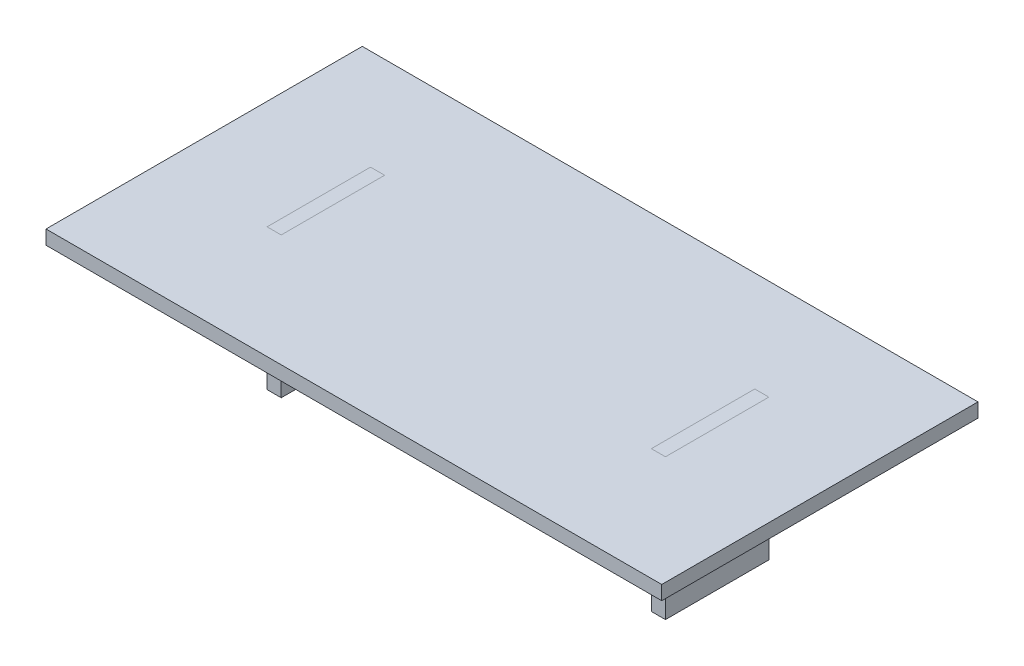
ISO-10303-21;
HEADER;
FILE_DESCRIPTION(('STEP AP214'),'2;1');
FILE_NAME('part.step','',(''),(''),'','','');
FILE_SCHEMA(('AUTOMOTIVE_DESIGN { 1 0 10303 214 1 1 1 1 }'));
ENDSEC;
DATA;
#1=APPLICATION_CONTEXT('core data for automotive mechanical design processes');
#2=APPLICATION_PROTOCOL_DEFINITION('international standard','automotive_design',2000,#1);
#3=PRODUCT_CONTEXT('',#1,'mechanical');
#4=PRODUCT('Part','Part','',(#3));
#5=PRODUCT_RELATED_PRODUCT_CATEGORY('part','',(#4));
#6=PRODUCT_DEFINITION_FORMATION('','',#4);
#7=PRODUCT_DEFINITION_CONTEXT('part definition',#1,'design');
#8=PRODUCT_DEFINITION('design','',#6,#7);
#9=PRODUCT_DEFINITION_SHAPE('','',#8);
#10=(LENGTH_UNIT() NAMED_UNIT(*) SI_UNIT(.MILLI.,.METRE.));
#11=(NAMED_UNIT(*) PLANE_ANGLE_UNIT() SI_UNIT($,.RADIAN.));
#12=(NAMED_UNIT(*) SI_UNIT($,.STERADIAN.) SOLID_ANGLE_UNIT());
#13=UNCERTAINTY_MEASURE_WITH_UNIT(LENGTH_MEASURE(1.E-05),#10,'distance_accuracy_value','');
#14=(GEOMETRIC_REPRESENTATION_CONTEXT(3) GLOBAL_UNCERTAINTY_ASSIGNED_CONTEXT((#13)) GLOBAL_UNIT_ASSIGNED_CONTEXT((#10,
#11,#12)) REPRESENTATION_CONTEXT('',''));
#15=CARTESIAN_POINT('',(0.,0.,0.));
#16=DIRECTION('',(0.,0.,1.));
#17=DIRECTION('',(1.,0.,0.));
#18=AXIS2_PLACEMENT_3D('',#15,#16,#17);
#19=CARTESIAN_POINT('',(0.,-30.,-11.));
#20=DIRECTION('',(0.,0.,-1.));
#21=DIRECTION('',(-1.,0.,0.));
#22=AXIS2_PLACEMENT_3D('',#19,#20,#21);
#23=PLANE('',#22);
#24=DIRECTION('',(-1.,0.,0.));
#25=VECTOR('',#24,1.);
#26=CARTESIAN_POINT('',(0.,0.,-11.));
#27=LINE('',#26,#25);
#28=CARTESIAN_POINT('',(42.1266181229774,0.,-11.));
#29=VERTEX_POINT('',#28);
#30=CARTESIAN_POINT('',(39.1266181229774,0.,-11.));
#31=VERTEX_POINT('',#30);
#32=EDGE_CURVE('E118',#29,#31,#27,.T.);
#33=ORIENTED_EDGE('',*,*,#32,.F.);
#34=DIRECTION('',(0.,1.,0.));
#35=VECTOR('',#34,1.);
#36=CARTESIAN_POINT('',(42.1266181229774,-30.,-11.));
#37=LINE('',#36,#35);
#38=CARTESIAN_POINT('',(42.1266181229774,-30.,-11.));
#39=VERTEX_POINT('',#38);
#40=EDGE_CURVE('E12',#39,#29,#37,.T.);
#41=ORIENTED_EDGE('',*,*,#40,.F.);
#42=DIRECTION('',(-1.,0.,0.));
#43=VECTOR('',#42,1.);
#44=CARTESIAN_POINT('',(0.,-30.,-11.));
#45=LINE('',#44,#43);
#46=CARTESIAN_POINT('',(39.1266181229774,-30.,-11.));
#47=VERTEX_POINT('',#46);
#48=EDGE_CURVE('E112',#39,#47,#45,.T.);
#49=ORIENTED_EDGE('',*,*,#48,.T.);
#50=DIRECTION('',(0.,1.,0.));
#51=VECTOR('',#50,1.);
#52=CARTESIAN_POINT('',(39.1266181229774,-30.,-11.));
#53=LINE('',#52,#51);
#54=EDGE_CURVE('E55',#47,#31,#53,.T.);
#55=ORIENTED_EDGE('',*,*,#54,.T.);
#56=EDGE_LOOP('',(#33,#41,#49,#55));
#57=FACE_BOUND('',#56,.T.);
#58=ADVANCED_FACE('F52',(#57),#23,.T.);
#59=CARTESIAN_POINT('',(42.1266181229774,-30.,0.));
#60=DIRECTION('',(-1.,0.,0.));
#61=DIRECTION('',(0.,0.,1.));
#62=AXIS2_PLACEMENT_3D('',#59,#60,#61);
#63=PLANE('',#62);
#64=CARTESIAN_POINT('',(42.1266181229774,-19.,0.));
#65=DIRECTION('',(1.,0.,0.));
#66=DIRECTION('',(0.,0.,-1.));
#67=AXIS2_PLACEMENT_3D('',#64,#65,#66);
#68=CIRCLE('',#67,1.5);
#69=CARTESIAN_POINT('',(42.1266181229774,-19.,-1.49999999999998));
#70=VERTEX_POINT('',#69);
#71=EDGE_CURVE('E150',#70,#70,#68,.T.);
#72=ORIENTED_EDGE('',*,*,#71,.F.);
#73=EDGE_LOOP('',(#72));
#74=FACE_BOUND('',#73,.T.);
#75=DIRECTION('',(0.,0.,1.));
#76=VECTOR('',#75,1.);
#77=CARTESIAN_POINT('',(42.1266181229774,0.,0.));
#78=LINE('',#77,#76);
#79=CARTESIAN_POINT('',(42.1266181229774,0.,11.));
#80=VERTEX_POINT('',#79);
#81=EDGE_CURVE('E85',#29,#80,#78,.T.);
#82=ORIENTED_EDGE('',*,*,#81,.T.);
#83=DIRECTION('',(0.,1.,0.));
#84=VECTOR('',#83,1.);
#85=CARTESIAN_POINT('',(42.1266181229774,-30.,11.));
#86=LINE('',#85,#84);
#87=CARTESIAN_POINT('',(42.1266181229774,-30.,11.));
#88=VERTEX_POINT('',#87);
#89=EDGE_CURVE('E61',#88,#80,#86,.T.);
#90=ORIENTED_EDGE('',*,*,#89,.F.);
#91=DIRECTION('',(0.,0.,1.));
#92=VECTOR('',#91,1.);
#93=CARTESIAN_POINT('',(42.1266181229774,-30.,0.));
#94=LINE('',#93,#92);
#95=EDGE_CURVE('E102',#39,#88,#94,.T.);
#96=ORIENTED_EDGE('',*,*,#95,.F.);
#97=ORIENTED_EDGE('',*,*,#40,.T.);
#98=EDGE_LOOP('',(#82,#90,#96,#97));
#99=FACE_BOUND('',#98,.T.);
#100=ADVANCED_FACE('F129',(#74,#99),#63,.F.);
#101=CARTESIAN_POINT('',(0.,-30.,11.));
#102=DIRECTION('',(0.,0.,-1.));
#103=DIRECTION('',(-1.,0.,0.));
#104=AXIS2_PLACEMENT_3D('',#101,#102,#103);
#105=PLANE('',#104);
#106=DIRECTION('',(-1.,0.,0.));
#107=VECTOR('',#106,1.);
#108=CARTESIAN_POINT('',(0.,0.,11.));
#109=LINE('',#108,#107);
#110=CARTESIAN_POINT('',(39.1266181229774,0.,11.));
#111=VERTEX_POINT('',#110);
#112=EDGE_CURVE('E109',#80,#111,#109,.T.);
#113=ORIENTED_EDGE('',*,*,#112,.T.);
#114=DIRECTION('',(0.,1.,0.));
#115=VECTOR('',#114,1.);
#116=CARTESIAN_POINT('',(39.1266181229774,-30.,11.));
#117=LINE('',#116,#115);
#118=CARTESIAN_POINT('',(39.1266181229774,-30.,11.));
#119=VERTEX_POINT('',#118);
#120=EDGE_CURVE('E106',#119,#111,#117,.T.);
#121=ORIENTED_EDGE('',*,*,#120,.F.);
#122=DIRECTION('',(-1.,0.,0.));
#123=VECTOR('',#122,1.);
#124=CARTESIAN_POINT('',(0.,-30.,11.));
#125=LINE('',#124,#123);
#126=EDGE_CURVE('E97',#88,#119,#125,.T.);
#127=ORIENTED_EDGE('',*,*,#126,.F.);
#128=ORIENTED_EDGE('',*,*,#89,.T.);
#129=EDGE_LOOP('',(#113,#121,#127,#128));
#130=FACE_BOUND('',#129,.T.);
#131=ADVANCED_FACE('F107',(#130),#105,.F.);
#132=CARTESIAN_POINT('',(39.1266181229774,-30.,0.));
#133=DIRECTION('',(-1.,0.,0.));
#134=DIRECTION('',(0.,0.,1.));
#135=AXIS2_PLACEMENT_3D('',#132,#133,#134);
#136=PLANE('',#135);
#137=CARTESIAN_POINT('',(39.1266181229774,-19.,0.));
#138=DIRECTION('',(-1.,0.,0.));
#139=DIRECTION('',(0.,0.,1.));
#140=AXIS2_PLACEMENT_3D('',#137,#138,#139);
#141=CIRCLE('',#140,1.5);
#142=CARTESIAN_POINT('',(39.1266181229774,-19.,-1.49999999999998));
#143=VERTEX_POINT('',#142);
#144=EDGE_CURVE('E122',#143,#143,#141,.F.);
#145=ORIENTED_EDGE('',*,*,#144,.T.);
#146=EDGE_LOOP('',(#145));
#147=FACE_BOUND('',#146,.T.);
#148=DIRECTION('',(0.,0.,1.));
#149=VECTOR('',#148,1.);
#150=CARTESIAN_POINT('',(39.1266181229774,0.,0.));
#151=LINE('',#150,#149);
#152=EDGE_CURVE('E121',#31,#111,#151,.T.);
#153=ORIENTED_EDGE('',*,*,#152,.F.);
#154=ORIENTED_EDGE('',*,*,#54,.F.);
#155=DIRECTION('',(0.,0.,1.));
#156=VECTOR('',#155,1.);
#157=CARTESIAN_POINT('',(39.1266181229774,-30.,0.));
#158=LINE('',#157,#156);
#159=EDGE_CURVE('E101',#47,#119,#158,.T.);
#160=ORIENTED_EDGE('',*,*,#159,.T.);
#161=ORIENTED_EDGE('',*,*,#120,.T.);
#162=EDGE_LOOP('',(#153,#154,#160,#161));
#163=FACE_BOUND('',#162,.T.);
#164=ADVANCED_FACE('F111',(#147,#163),#136,.T.);
#165=CARTESIAN_POINT('',(0.,-30.,0.));
#166=DIRECTION('',(0.,1.,0.));
#167=DIRECTION('',(0.,0.,1.));
#168=AXIS2_PLACEMENT_3D('',#165,#166,#167);
#169=PLANE('',#168);
#170=ORIENTED_EDGE('',*,*,#48,.F.);
#171=ORIENTED_EDGE('',*,*,#95,.T.);
#172=ORIENTED_EDGE('',*,*,#126,.T.);
#173=ORIENTED_EDGE('',*,*,#159,.F.);
#174=EDGE_LOOP('',(#170,#171,#172,#173));
#175=FACE_BOUND('',#174,.T.);
#176=ADVANCED_FACE('F100',(#175),#169,.F.);
#177=CARTESIAN_POINT('',(0.,0.,0.));
#178=DIRECTION('',(0.,1.,0.));
#179=DIRECTION('',(0.,0.,1.));
#180=AXIS2_PLACEMENT_3D('',#177,#178,#179);
#181=PLANE('',#180);
#182=ORIENTED_EDGE('',*,*,#32,.T.);
#183=ORIENTED_EDGE('',*,*,#152,.T.);
#184=ORIENTED_EDGE('',*,*,#112,.F.);
#185=ORIENTED_EDGE('',*,*,#81,.F.);
#186=EDGE_LOOP('',(#182,#183,#184,#185));
#187=FACE_BOUND('',#186,.T.);
#188=ADVANCED_FACE('F127',(#187),#181,.T.);
#189=CARTESIAN_POINT('',(34.8839774358581,-19.,0.));
#190=DIRECTION('',(1.,0.,0.));
#191=DIRECTION('',(0.,0.,-1.));
#192=AXIS2_PLACEMENT_3D('',#189,#190,#191);
#193=CYLINDRICAL_SURFACE('',#192,1.5);
#194=CARTESIAN_POINT('',(42.1266181229774,-19.,-1.49999999999998));
#195=CARTESIAN_POINT('',(42.0953681229774,-19.,-1.49999999999998));
#196=CARTESIAN_POINT('',(42.0641181229774,-19.,-1.49999999999998));
#197=CARTESIAN_POINT('',(42.0016181229774,-19.,-1.49999999999998));
#198=CARTESIAN_POINT('',(41.9703681229774,-19.,-1.49999999999998));
#199=CARTESIAN_POINT('',(41.9078681229774,-19.,-1.49999999999998));
#200=CARTESIAN_POINT('',(41.8766181229774,-19.,-1.49999999999998));
#201=CARTESIAN_POINT('',(41.8141181229774,-19.,-1.49999999999998));
#202=CARTESIAN_POINT('',(41.7828681229774,-19.,-1.49999999999998));
#203=CARTESIAN_POINT('',(41.7203681229774,-19.,-1.49999999999998));
#204=CARTESIAN_POINT('',(41.6891181229774,-19.,-1.49999999999998));
#205=CARTESIAN_POINT('',(41.6266181229774,-19.,-1.49999999999998));
#206=CARTESIAN_POINT('',(41.5953681229774,-19.,-1.49999999999998));
#207=CARTESIAN_POINT('',(41.5328681229774,-19.,-1.49999999999998));
#208=CARTESIAN_POINT('',(41.5016181229774,-19.,-1.49999999999998));
#209=CARTESIAN_POINT('',(41.4391181229774,-19.,-1.49999999999998));
#210=CARTESIAN_POINT('',(41.4078681229774,-19.,-1.49999999999998));
#211=CARTESIAN_POINT('',(41.3453681229774,-19.,-1.49999999999998));
#212=CARTESIAN_POINT('',(41.3141181229774,-19.,-1.49999999999998));
#213=CARTESIAN_POINT('',(41.2516181229774,-19.,-1.49999999999998));
#214=CARTESIAN_POINT('',(41.2203681229774,-19.,-1.49999999999998));
#215=CARTESIAN_POINT('',(41.1578681229774,-19.,-1.49999999999998));
#216=CARTESIAN_POINT('',(41.1266181229774,-19.,-1.49999999999998));
#217=CARTESIAN_POINT('',(41.0641181229774,-19.,-1.49999999999998));
#218=CARTESIAN_POINT('',(41.0328681229774,-19.,-1.49999999999998));
#219=CARTESIAN_POINT('',(40.9703681229774,-19.,-1.49999999999998));
#220=CARTESIAN_POINT('',(40.9391181229774,-19.,-1.49999999999998));
#221=CARTESIAN_POINT('',(40.8766181229774,-19.,-1.49999999999998));
#222=CARTESIAN_POINT('',(40.8453681229774,-19.,-1.49999999999998));
#223=CARTESIAN_POINT('',(40.7828681229774,-19.,-1.49999999999998));
#224=CARTESIAN_POINT('',(40.7516181229774,-19.,-1.49999999999998));
#225=CARTESIAN_POINT('',(40.6891181229774,-19.,-1.49999999999998));
#226=CARTESIAN_POINT('',(40.6578681229774,-19.,-1.49999999999998));
#227=CARTESIAN_POINT('',(40.5953681229774,-19.,-1.49999999999998));
#228=CARTESIAN_POINT('',(40.5641181229774,-19.,-1.49999999999998));
#229=CARTESIAN_POINT('',(40.5016181229774,-19.,-1.49999999999998));
#230=CARTESIAN_POINT('',(40.4703681229774,-19.,-1.49999999999998));
#231=CARTESIAN_POINT('',(40.4078681229774,-19.,-1.49999999999998));
#232=CARTESIAN_POINT('',(40.3766181229774,-19.,-1.49999999999998));
#233=CARTESIAN_POINT('',(40.3141181229774,-19.,-1.49999999999998));
#234=CARTESIAN_POINT('',(40.2828681229774,-19.,-1.49999999999998));
#235=CARTESIAN_POINT('',(40.2203681229774,-19.,-1.49999999999998));
#236=CARTESIAN_POINT('',(40.1891181229774,-19.,-1.49999999999998));
#237=CARTESIAN_POINT('',(40.1266181229774,-19.,-1.49999999999998));
#238=CARTESIAN_POINT('',(40.0953681229774,-19.,-1.49999999999998));
#239=CARTESIAN_POINT('',(40.0328681229774,-19.,-1.49999999999998));
#240=CARTESIAN_POINT('',(40.0016181229774,-19.,-1.49999999999998));
#241=CARTESIAN_POINT('',(39.9391181229774,-19.,-1.49999999999998));
#242=CARTESIAN_POINT('',(39.9078681229774,-19.,-1.49999999999998));
#243=CARTESIAN_POINT('',(39.8453681229774,-19.,-1.49999999999998));
#244=CARTESIAN_POINT('',(39.8141181229774,-19.,-1.49999999999998));
#245=CARTESIAN_POINT('',(39.7516181229774,-19.,-1.49999999999998));
#246=CARTESIAN_POINT('',(39.7203681229774,-19.,-1.49999999999998));
#247=CARTESIAN_POINT('',(39.6578681229774,-19.,-1.49999999999998));
#248=CARTESIAN_POINT('',(39.6266181229774,-19.,-1.49999999999998));
#249=CARTESIAN_POINT('',(39.5641181229774,-19.,-1.49999999999998));
#250=CARTESIAN_POINT('',(39.5328681229774,-19.,-1.49999999999998));
#251=CARTESIAN_POINT('',(39.4703681229774,-19.,-1.49999999999998));
#252=CARTESIAN_POINT('',(39.4391181229774,-19.,-1.49999999999998));
#253=CARTESIAN_POINT('',(39.3766181229774,-19.,-1.49999999999998));
#254=CARTESIAN_POINT('',(39.3453681229774,-19.,-1.49999999999998));
#255=CARTESIAN_POINT('',(39.2828681229774,-19.,-1.49999999999998));
#256=CARTESIAN_POINT('',(39.2516181229774,-19.,-1.49999999999998));
#257=CARTESIAN_POINT('',(39.1891181229774,-19.,-1.49999999999998));
#258=CARTESIAN_POINT('',(39.1578681229774,-19.,-1.49999999999998));
#259=CARTESIAN_POINT('',(39.1266181229774,-19.,-1.49999999999998));
#260=B_SPLINE_CURVE_WITH_KNOTS('',3,(#194,#195,#196,#197,#198,#199,#200,#201,#202,#203,#204,
#205,#206,#207,#208,#209,#210,#211,#212,#213,#214,#215,#216,#217,#218,#219,#220,#221,#222,#223,
#224,#225,#226,#227,#228,#229,#230,#231,#232,#233,#234,#235,#236,#237,#238,#239,#240,#241,#242,
#243,#244,#245,#246,#247,#248,#249,#250,#251,#252,#253,#254,#255,#256,#257,#258,#259),
.UNSPECIFIED.,.F.,.F.,(4,2,2,2,2,2,2,2,2,2,2,2,2,2,2,2,2,2,2,2,2,2,2,2,2,2,2,2,2,2,2,2,4),(0.,
0.0937499999999966,0.1875,0.281249999999997,0.374999999999993,0.468749999999997,
0.562499999999994,0.656249999999997,0.749999999999994,0.843749999999997,0.937499999999994,
1.03125,1.12499999999999,1.21875,1.31249999999999,1.40624999999999,1.49999999999999,1.59375,
1.68749999999999,1.78124999999999,1.87499999999999,1.96874999999999,2.06249999999999,
2.15624999999999,2.25,2.34374999999999,2.4375,2.53124999999999,2.625,2.71874999999999,
2.81249999999999,2.90624999999999,2.99999999999999),.UNSPECIFIED.);
#261=EDGE_CURVE('BSEAM154',#70,#143,#260,.T.);
#262=ORIENTED_EDGE('',*,*,#71,.T.);
#263=ORIENTED_EDGE('',*,*,#144,.F.);
#264=ORIENTED_EDGE('',*,*,#261,.T.);
#265=ORIENTED_EDGE('',*,*,#261,.F.);
#266=EDGE_LOOP('',(#262,#264,#263,#265));
#267=FACE_BOUND('',#266,.T.);
#268=ADVANCED_FACE('F154',(#267),#193,.F.);
#269=CLOSED_SHELL('',(#58,#100,#131,#164,#176,#188,#268));
#270=MANIFOLD_SOLID_BREP('B2',#269);
#271=CARTESIAN_POINT('',(-39.6233818770227,-30.,0.));
#272=DIRECTION('',(-1.,0.,0.));
#273=DIRECTION('',(0.,0.,1.));
#274=AXIS2_PLACEMENT_3D('',#271,#272,#273);
#275=PLANE('',#274);
#276=CARTESIAN_POINT('',(-39.6233818770227,-13.3431457505077,-5.65685424949241));
#277=DIRECTION('',(-1.,0.,0.));
#278=DIRECTION('',(0.,0.,1.));
#279=AXIS2_PLACEMENT_3D('',#276,#277,#278);
#280=CIRCLE('',#279,1.1);
#281=CARTESIAN_POINT('',(-39.6233818770227,-13.3431457505077,-4.55685424949241));
#282=VERTEX_POINT('',#281);
#283=EDGE_CURVE('E304',#282,#282,#280,.F.);
#284=ORIENTED_EDGE('',*,*,#283,.F.);
#285=EDGE_LOOP('',(#284));
#286=FACE_BOUND('',#285,.T.);
#287=CARTESIAN_POINT('',(-39.6233818770227,-24.6568542494924,5.65685424949237));
#288=DIRECTION('',(-1.,0.,0.));
#289=DIRECTION('',(0.,0.,1.));
#290=AXIS2_PLACEMENT_3D('',#287,#288,#289);
#291=CIRCLE('',#290,1.1);
#292=CARTESIAN_POINT('',(-39.6233818770227,-24.6568542494924,6.75685424949237));
#293=VERTEX_POINT('',#292);
#294=EDGE_CURVE('E299',#293,#293,#291,.F.);
#295=ORIENTED_EDGE('',*,*,#294,.F.);
#296=EDGE_LOOP('',(#295));
#297=FACE_BOUND('',#296,.T.);
#298=CARTESIAN_POINT('',(-39.6233818770227,-13.3431457505077,5.65685424949241));
#299=DIRECTION('',(-1.,0.,0.));
#300=DIRECTION('',(0.,0.,1.));
#301=AXIS2_PLACEMENT_3D('',#298,#299,#300);
#302=CIRCLE('',#301,1.1);
#303=CARTESIAN_POINT('',(-39.6233818770227,-13.3431457505077,6.75685424949241));
#304=VERTEX_POINT('',#303);
#305=EDGE_CURVE('E316',#304,#304,#302,.F.);
#306=ORIENTED_EDGE('',*,*,#305,.F.);
#307=EDGE_LOOP('',(#306));
#308=FACE_BOUND('',#307,.T.);
#309=CARTESIAN_POINT('',(-39.6233818770227,-19.,0.));
#310=DIRECTION('',(-1.,0.,0.));
#311=DIRECTION('',(0.,0.,1.));
#312=AXIS2_PLACEMENT_3D('',#309,#310,#311);
#313=CIRCLE('',#312,3.);
#314=CARTESIAN_POINT('',(-39.6233818770227,-19.,3.));
#315=VERTEX_POINT('',#314);
#316=EDGE_CURVE('E283',#315,#315,#313,.F.);
#317=ORIENTED_EDGE('',*,*,#316,.F.);
#318=EDGE_LOOP('',(#317));
#319=FACE_BOUND('',#318,.T.);
#320=CARTESIAN_POINT('',(-39.6233818770227,-24.6568542494923,-5.65685424949241));
#321=DIRECTION('',(-1.,0.,0.));
#322=DIRECTION('',(0.,0.,1.));
#323=AXIS2_PLACEMENT_3D('',#320,#321,#322);
#324=CIRCLE('',#323,1.1);
#325=CARTESIAN_POINT('',(-39.6233818770227,-24.6568542494923,-4.55685424949241));
#326=VERTEX_POINT('',#325);
#327=EDGE_CURVE('E296',#326,#326,#324,.F.);
#328=ORIENTED_EDGE('',*,*,#327,.F.);
#329=EDGE_LOOP('',(#328));
#330=FACE_BOUND('',#329,.T.);
#331=DIRECTION('',(0.,0.,1.));
#332=VECTOR('',#331,1.);
#333=CARTESIAN_POINT('',(-39.6233818770227,0.,0.));
#334=LINE('',#333,#332);
#335=CARTESIAN_POINT('',(-39.6233818770227,0.,-11.));
#336=VERTEX_POINT('',#335);
#337=CARTESIAN_POINT('',(-39.6233818770227,0.,11.));
#338=VERTEX_POINT('',#337);
#339=EDGE_CURVE('E280',#336,#338,#334,.T.);
#340=ORIENTED_EDGE('',*,*,#339,.T.);
#341=DIRECTION('',(0.,1.,0.));
#342=VECTOR('',#341,1.);
#343=CARTESIAN_POINT('',(-39.6233818770227,-30.,11.));
#344=LINE('',#343,#342);
#345=CARTESIAN_POINT('',(-39.6233818770227,-30.,11.));
#346=VERTEX_POINT('',#345);
#347=EDGE_CURVE('E50',#346,#338,#344,.T.);
#348=ORIENTED_EDGE('',*,*,#347,.F.);
#349=DIRECTION('',(0.,0.,1.));
#350=VECTOR('',#349,1.);
#351=CARTESIAN_POINT('',(-39.6233818770227,-30.,0.));
#352=LINE('',#351,#350);
#353=CARTESIAN_POINT('',(-39.6233818770227,-30.,-11.));
#354=VERTEX_POINT('',#353);
#355=EDGE_CURVE('E236',#354,#346,#352,.T.);
#356=ORIENTED_EDGE('',*,*,#355,.F.);
#357=DIRECTION('',(0.,1.,0.));
#358=VECTOR('',#357,1.);
#359=CARTESIAN_POINT('',(-39.6233818770227,-30.,-11.));
#360=LINE('',#359,#358);
#361=EDGE_CURVE('E221',#354,#336,#360,.T.);
#362=ORIENTED_EDGE('',*,*,#361,.T.);
#363=EDGE_LOOP('',(#340,#348,#356,#362));
#364=FACE_BOUND('',#363,.T.);
#365=ADVANCED_FACE('F218',(#286,#297,#308,#319,#330,#364),#275,.F.);
#366=CARTESIAN_POINT('',(0.,-30.,11.));
#367=DIRECTION('',(0.,0.,1.));
#368=DIRECTION('',(1.,0.,0.));
#369=AXIS2_PLACEMENT_3D('',#366,#367,#368);
#370=PLANE('',#369);
#371=DIRECTION('',(1.,0.,0.));
#372=VECTOR('',#371,1.);
#373=CARTESIAN_POINT('',(0.,0.,11.));
#374=LINE('',#373,#372);
#375=CARTESIAN_POINT('',(-42.6233818770227,0.,11.));
#376=VERTEX_POINT('',#375);
#377=EDGE_CURVE('E286',#376,#338,#374,.T.);
#378=ORIENTED_EDGE('',*,*,#377,.F.);
#379=DIRECTION('',(0.,1.,0.));
#380=VECTOR('',#379,1.);
#381=CARTESIAN_POINT('',(-42.6233818770227,-30.,11.));
#382=LINE('',#381,#380);
#383=CARTESIAN_POINT('',(-42.6233818770227,-30.,11.));
#384=VERTEX_POINT('',#383);
#385=EDGE_CURVE('E227',#384,#376,#382,.T.);
#386=ORIENTED_EDGE('',*,*,#385,.F.);
#387=DIRECTION('',(1.,0.,0.));
#388=VECTOR('',#387,1.);
#389=CARTESIAN_POINT('',(0.,-30.,11.));
#390=LINE('',#389,#388);
#391=EDGE_CURVE('E275',#384,#346,#390,.T.);
#392=ORIENTED_EDGE('',*,*,#391,.T.);
#393=ORIENTED_EDGE('',*,*,#347,.T.);
#394=EDGE_LOOP('',(#378,#386,#392,#393));
#395=FACE_BOUND('',#394,.T.);
#396=ADVANCED_FACE('F326',(#395),#370,.T.);
#397=CARTESIAN_POINT('',(-42.6233818770227,-30.,0.));
#398=DIRECTION('',(-1.,0.,0.));
#399=DIRECTION('',(0.,0.,1.));
#400=AXIS2_PLACEMENT_3D('',#397,#398,#399);
#401=PLANE('',#400);
#402=CARTESIAN_POINT('',(-42.6233818770227,-13.3431457505077,-5.65685424949241));
#403=DIRECTION('',(-1.,0.,0.));
#404=DIRECTION('',(0.,-1.,0.));
#405=AXIS2_PLACEMENT_3D('',#402,#403,#404);
#406=CIRCLE('',#405,1.1);
#407=CARTESIAN_POINT('',(-42.6233818770227,-14.4431457505077,-5.6568542494924));
#408=VERTEX_POINT('',#407);
#409=EDGE_CURVE('E308',#408,#408,#406,.T.);
#410=ORIENTED_EDGE('',*,*,#409,.F.);
#411=EDGE_LOOP('',(#410));
#412=FACE_BOUND('',#411,.T.);
#413=CARTESIAN_POINT('',(-42.6233818770227,-24.6568542494924,5.65685424949237));
#414=DIRECTION('',(-1.,0.,0.));
#415=DIRECTION('',(0.,1.,0.));
#416=AXIS2_PLACEMENT_3D('',#413,#414,#415);
#417=CIRCLE('',#416,1.1);
#418=CARTESIAN_POINT('',(-42.6233818770227,-23.5568542494924,5.65685424949237));
#419=VERTEX_POINT('',#418);
#420=EDGE_CURVE('E313',#419,#419,#417,.T.);
#421=ORIENTED_EDGE('',*,*,#420,.F.);
#422=EDGE_LOOP('',(#421));
#423=FACE_BOUND('',#422,.T.);
#424=CARTESIAN_POINT('',(-42.6233818770227,-13.3431457505077,5.65685424949241));
#425=DIRECTION('',(-1.,0.,0.));
#426=DIRECTION('',(0.,0.,-1.));
#427=AXIS2_PLACEMENT_3D('',#424,#425,#426);
#428=CIRCLE('',#427,1.1);
#429=CARTESIAN_POINT('',(-42.6233818770227,-13.3431457505077,4.55685424949241));
#430=VERTEX_POINT('',#429);
#431=EDGE_CURVE('E307',#430,#430,#428,.T.);
#432=ORIENTED_EDGE('',*,*,#431,.F.);
#433=EDGE_LOOP('',(#432));
#434=FACE_BOUND('',#433,.T.);
#435=CARTESIAN_POINT('',(-42.6233818770227,-19.,0.));
#436=DIRECTION('',(-1.,0.,0.));
#437=DIRECTION('',(0.,0.,1.));
#438=AXIS2_PLACEMENT_3D('',#435,#436,#437);
#439=CIRCLE('',#438,3.);
#440=CARTESIAN_POINT('',(-42.6233818770227,-19.,3.));
#441=VERTEX_POINT('',#440);
#442=EDGE_CURVE('E295',#441,#441,#439,.T.);
#443=ORIENTED_EDGE('',*,*,#442,.F.);
#444=EDGE_LOOP('',(#443));
#445=FACE_BOUND('',#444,.T.);
#446=CARTESIAN_POINT('',(-42.6233818770227,-24.6568542494923,-5.65685424949241));
#447=DIRECTION('',(-1.,0.,0.));
#448=DIRECTION('',(0.,0.,1.));
#449=AXIS2_PLACEMENT_3D('',#446,#447,#448);
#450=CIRCLE('',#449,1.1);
#451=CARTESIAN_POINT('',(-42.6233818770227,-24.6568542494923,-4.55685424949241));
#452=VERTEX_POINT('',#451);
#453=EDGE_CURVE('E292',#452,#452,#450,.T.);
#454=ORIENTED_EDGE('',*,*,#453,.F.);
#455=EDGE_LOOP('',(#454));
#456=FACE_BOUND('',#455,.T.);
#457=DIRECTION('',(0.,0.,1.));
#458=VECTOR('',#457,1.);
#459=CARTESIAN_POINT('',(-42.6233818770227,0.,0.));
#460=LINE('',#459,#458);
#461=CARTESIAN_POINT('',(-42.6233818770227,0.,-11.));
#462=VERTEX_POINT('',#461);
#463=EDGE_CURVE('E268',#462,#376,#460,.T.);
#464=ORIENTED_EDGE('',*,*,#463,.F.);
#465=DIRECTION('',(0.,1.,0.));
#466=VECTOR('',#465,1.);
#467=CARTESIAN_POINT('',(-42.6233818770227,-30.,-11.));
#468=LINE('',#467,#466);
#469=CARTESIAN_POINT('',(-42.6233818770227,-30.,-11.));
#470=VERTEX_POINT('',#469);
#471=EDGE_CURVE('E265',#470,#462,#468,.T.);
#472=ORIENTED_EDGE('',*,*,#471,.F.);
#473=DIRECTION('',(0.,0.,1.));
#474=VECTOR('',#473,1.);
#475=CARTESIAN_POINT('',(-42.6233818770227,-30.,0.));
#476=LINE('',#475,#474);
#477=EDGE_CURVE('E267',#470,#384,#476,.T.);
#478=ORIENTED_EDGE('',*,*,#477,.T.);
#479=ORIENTED_EDGE('',*,*,#385,.T.);
#480=EDGE_LOOP('',(#464,#472,#478,#479));
#481=FACE_BOUND('',#480,.T.);
#482=ADVANCED_FACE('F266',(#412,#423,#434,#445,#456,#481),#401,.T.);
#483=CARTESIAN_POINT('',(0.,-30.,-11.));
#484=DIRECTION('',(0.,0.,1.));
#485=DIRECTION('',(1.,0.,0.));
#486=AXIS2_PLACEMENT_3D('',#483,#484,#485);
#487=PLANE('',#486);
#488=DIRECTION('',(1.,0.,0.));
#489=VECTOR('',#488,1.);
#490=CARTESIAN_POINT('',(0.,0.,-11.));
#491=LINE('',#490,#489);
#492=EDGE_CURVE('E282',#462,#336,#491,.T.);
#493=ORIENTED_EDGE('',*,*,#492,.T.);
#494=ORIENTED_EDGE('',*,*,#361,.F.);
#495=DIRECTION('',(1.,0.,0.));
#496=VECTOR('',#495,1.);
#497=CARTESIAN_POINT('',(0.,-30.,-11.));
#498=LINE('',#497,#496);
#499=EDGE_CURVE('E262',#470,#354,#498,.T.);
#500=ORIENTED_EDGE('',*,*,#499,.F.);
#501=ORIENTED_EDGE('',*,*,#471,.T.);
#502=EDGE_LOOP('',(#493,#494,#500,#501));
#503=FACE_BOUND('',#502,.T.);
#504=ADVANCED_FACE('F271',(#503),#487,.F.);
#505=CARTESIAN_POINT('',(0.,-30.,0.));
#506=DIRECTION('',(0.,1.,0.));
#507=DIRECTION('',(0.,0.,1.));
#508=AXIS2_PLACEMENT_3D('',#505,#506,#507);
#509=PLANE('',#508);
#510=ORIENTED_EDGE('',*,*,#355,.T.);
#511=ORIENTED_EDGE('',*,*,#391,.F.);
#512=ORIENTED_EDGE('',*,*,#477,.F.);
#513=ORIENTED_EDGE('',*,*,#499,.T.);
#514=EDGE_LOOP('',(#510,#511,#512,#513));
#515=FACE_BOUND('',#514,.T.);
#516=ADVANCED_FACE('F274',(#515),#509,.F.);
#517=CARTESIAN_POINT('',(0.,0.,0.));
#518=DIRECTION('',(0.,1.,0.));
#519=DIRECTION('',(0.,0.,1.));
#520=AXIS2_PLACEMENT_3D('',#517,#518,#519);
#521=PLANE('',#520);
#522=ORIENTED_EDGE('',*,*,#339,.F.);
#523=ORIENTED_EDGE('',*,*,#492,.F.);
#524=ORIENTED_EDGE('',*,*,#463,.T.);
#525=ORIENTED_EDGE('',*,*,#377,.T.);
#526=EDGE_LOOP('',(#522,#523,#524,#525));
#527=FACE_BOUND('',#526,.T.);
#528=ADVANCED_FACE('F336',(#527),#521,.T.);
#529=CARTESIAN_POINT('',(-31.1381005027841,-24.6568542494923,-5.65685424949241));
#530=DIRECTION('',(-1.,0.,0.));
#531=DIRECTION('',(0.,0.,1.));
#532=AXIS2_PLACEMENT_3D('',#529,#530,#531);
#533=CYLINDRICAL_SURFACE('',#532,1.1);
#534=ORIENTED_EDGE('',*,*,#327,.T.);
#535=EDGE_LOOP('',(#534));
#536=FACE_BOUND('',#535,.T.);
#537=ORIENTED_EDGE('',*,*,#453,.T.);
#538=EDGE_LOOP('',(#537));
#539=FACE_BOUND('',#538,.T.);
#540=ADVANCED_FACE('F333',(#536,#539),#533,.F.);
#541=CARTESIAN_POINT('',(-31.1381005027841,-19.,0.));
#542=DIRECTION('',(-1.,0.,0.));
#543=DIRECTION('',(0.,0.,1.));
#544=AXIS2_PLACEMENT_3D('',#541,#542,#543);
#545=CYLINDRICAL_SURFACE('',#544,3.);
#546=ORIENTED_EDGE('',*,*,#316,.T.);
#547=EDGE_LOOP('',(#546));
#548=FACE_BOUND('',#547,.T.);
#549=ORIENTED_EDGE('',*,*,#442,.T.);
#550=EDGE_LOOP('',(#549));
#551=FACE_BOUND('',#550,.T.);
#552=ADVANCED_FACE('F335',(#548,#551),#545,.F.);
#553=CARTESIAN_POINT('',(-31.1381005027841,-13.3431457505077,5.65685424949241));
#554=DIRECTION('',(-1.,0.,0.));
#555=DIRECTION('',(0.,0.,1.));
#556=AXIS2_PLACEMENT_3D('',#553,#554,#555);
#557=CYLINDRICAL_SURFACE('',#556,1.1);
#558=ORIENTED_EDGE('',*,*,#305,.T.);
#559=EDGE_LOOP('',(#558));
#560=FACE_BOUND('',#559,.T.);
#561=ORIENTED_EDGE('',*,*,#431,.T.);
#562=EDGE_LOOP('',(#561));
#563=FACE_BOUND('',#562,.T.);
#564=ADVANCED_FACE('F322',(#560,#563),#557,.F.);
#565=CARTESIAN_POINT('',(-31.1381005027841,-24.6568542494924,5.65685424949237));
#566=DIRECTION('',(-1.,0.,0.));
#567=DIRECTION('',(0.,0.,1.));
#568=AXIS2_PLACEMENT_3D('',#565,#566,#567);
#569=CYLINDRICAL_SURFACE('',#568,1.1);
#570=ORIENTED_EDGE('',*,*,#294,.T.);
#571=EDGE_LOOP('',(#570));
#572=FACE_BOUND('',#571,.T.);
#573=ORIENTED_EDGE('',*,*,#420,.T.);
#574=EDGE_LOOP('',(#573));
#575=FACE_BOUND('',#574,.T.);
#576=ADVANCED_FACE('F366',(#572,#575),#569,.F.);
#577=CARTESIAN_POINT('',(-31.1381005027841,-13.3431457505077,-5.65685424949241));
#578=DIRECTION('',(-1.,0.,0.));
#579=DIRECTION('',(0.,0.,1.));
#580=AXIS2_PLACEMENT_3D('',#577,#578,#579);
#581=CYLINDRICAL_SURFACE('',#580,1.1);
#582=ORIENTED_EDGE('',*,*,#283,.T.);
#583=EDGE_LOOP('',(#582));
#584=FACE_BOUND('',#583,.T.);
#585=ORIENTED_EDGE('',*,*,#409,.T.);
#586=EDGE_LOOP('',(#585));
#587=FACE_BOUND('',#586,.T.);
#588=ADVANCED_FACE('F371',(#584,#587),#581,.F.);
#589=CLOSED_SHELL('',(#365,#396,#482,#504,#516,#528,#540,#552,#564,#576,#588));
#590=MANIFOLD_SOLID_BREP('B6',#589);
#591=CARTESIAN_POINT('',(0.,-3.,-11.));
#592=DIRECTION('',(0.,0.,1.));
#593=DIRECTION('',(1.,0.,0.));
#594=AXIS2_PLACEMENT_3D('',#591,#592,#593);
#595=PLANE('',#594);
#596=DIRECTION('',(1.,0.,0.));
#597=VECTOR('',#596,1.);
#598=CARTESIAN_POINT('',(0.,0.,-11.));
#599=LINE('',#598,#597);
#600=CARTESIAN_POINT('',(-42.6233818770227,0.,-11.));
#601=VERTEX_POINT('',#600);
#602=CARTESIAN_POINT('',(-39.6233818770227,0.,-11.));
#603=VERTEX_POINT('',#602);
#604=EDGE_CURVE('E618',#601,#603,#599,.T.);
#605=ORIENTED_EDGE('',*,*,#604,.F.);
#606=DIRECTION('',(0.,1.,0.));
#607=VECTOR('',#606,1.);
#608=CARTESIAN_POINT('',(-42.6233818770227,-3.,-11.));
#609=LINE('',#608,#607);
#610=CARTESIAN_POINT('',(-42.6233818770227,-3.,-11.));
#611=VERTEX_POINT('',#610);
#612=EDGE_CURVE('E216',#611,#601,#609,.T.);
#613=ORIENTED_EDGE('',*,*,#612,.F.);
#614=DIRECTION('',(1.,0.,0.));
#615=VECTOR('',#614,1.);
#616=CARTESIAN_POINT('',(0.,-3.,-11.));
#617=LINE('',#616,#615);
#618=CARTESIAN_POINT('',(-39.6233818770227,-3.,-11.));
#619=VERTEX_POINT('',#618);
#620=EDGE_CURVE('E578',#611,#619,#617,.T.);
#621=ORIENTED_EDGE('',*,*,#620,.T.);
#622=DIRECTION('',(0.,1.,0.));
#623=VECTOR('',#622,1.);
#624=CARTESIAN_POINT('',(-39.6233818770227,-3.,-11.));
#625=LINE('',#624,#623);
#626=EDGE_CURVE('E574',#619,#603,#625,.T.);
#627=ORIENTED_EDGE('',*,*,#626,.T.);
#628=EDGE_LOOP('',(#605,#613,#621,#627));
#629=FACE_BOUND('',#628,.T.);
#630=ADVANCED_FACE('F459',(#629),#595,.T.);
#631=CARTESIAN_POINT('',(-42.6233818770227,-3.,0.));
#632=DIRECTION('',(-1.,0.,0.));
#633=DIRECTION('',(0.,0.,1.));
#634=AXIS2_PLACEMENT_3D('',#631,#632,#633);
#635=PLANE('',#634);
#636=DIRECTION('',(0.,0.,1.));
#637=VECTOR('',#636,1.);
#638=CARTESIAN_POINT('',(-42.6233818770227,0.,0.));
#639=LINE('',#638,#637);
#640=CARTESIAN_POINT('',(-42.6233818770227,0.,11.));
#641=VERTEX_POINT('',#640);
#642=EDGE_CURVE('E627',#601,#641,#639,.T.);
#643=ORIENTED_EDGE('',*,*,#642,.T.);
#644=DIRECTION('',(0.,1.,0.));
#645=VECTOR('',#644,1.);
#646=CARTESIAN_POINT('',(-42.6233818770227,-3.,11.));
#647=LINE('',#646,#645);
#648=CARTESIAN_POINT('',(-42.6233818770227,-3.,11.));
#649=VERTEX_POINT('',#648);
#650=EDGE_CURVE('E470',#649,#641,#647,.T.);
#651=ORIENTED_EDGE('',*,*,#650,.F.);
#652=DIRECTION('',(0.,0.,1.));
#653=VECTOR('',#652,1.);
#654=CARTESIAN_POINT('',(-42.6233818770227,-3.,0.));
#655=LINE('',#654,#653);
#656=EDGE_CURVE('E564',#611,#649,#655,.T.);
#657=ORIENTED_EDGE('',*,*,#656,.F.);
#658=ORIENTED_EDGE('',*,*,#612,.T.);
#659=EDGE_LOOP('',(#643,#651,#657,#658));
#660=FACE_BOUND('',#659,.T.);
#661=ADVANCED_FACE('F679',(#660),#635,.F.);
#662=CARTESIAN_POINT('',(0.,-3.,11.));
#663=DIRECTION('',(0.,0.,1.));
#664=DIRECTION('',(1.,0.,0.));
#665=AXIS2_PLACEMENT_3D('',#662,#663,#664);
#666=PLANE('',#665);
#667=DIRECTION('',(1.,0.,0.));
#668=VECTOR('',#667,1.);
#669=CARTESIAN_POINT('',(0.,0.,11.));
#670=LINE('',#669,#668);
#671=CARTESIAN_POINT('',(-39.6233818770227,0.,11.));
#672=VERTEX_POINT('',#671);
#673=EDGE_CURVE('E519',#641,#672,#670,.T.);
#674=ORIENTED_EDGE('',*,*,#673,.T.);
#675=DIRECTION('',(0.,1.,0.));
#676=VECTOR('',#675,1.);
#677=CARTESIAN_POINT('',(-39.6233818770227,-3.,11.));
#678=LINE('',#677,#676);
#679=CARTESIAN_POINT('',(-39.6233818770227,-3.,11.));
#680=VERTEX_POINT('',#679);
#681=EDGE_CURVE('E569',#680,#672,#678,.T.);
#682=ORIENTED_EDGE('',*,*,#681,.F.);
#683=DIRECTION('',(1.,0.,0.));
#684=VECTOR('',#683,1.);
#685=CARTESIAN_POINT('',(0.,-3.,11.));
#686=LINE('',#685,#684);
#687=EDGE_CURVE('E558',#649,#680,#686,.T.);
#688=ORIENTED_EDGE('',*,*,#687,.F.);
#689=ORIENTED_EDGE('',*,*,#650,.T.);
#690=EDGE_LOOP('',(#674,#682,#688,#689));
#691=FACE_BOUND('',#690,.T.);
#692=ADVANCED_FACE('F570',(#691),#666,.F.);
#693=CARTESIAN_POINT('',(39.1266181229774,-3.,0.));
#694=DIRECTION('',(-1.,0.,0.));
#695=DIRECTION('',(0.,0.,1.));
#696=AXIS2_PLACEMENT_3D('',#693,#694,#695);
#697=PLANE('',#696);
#698=DIRECTION('',(0.,0.,1.));
#699=VECTOR('',#698,1.);
#700=CARTESIAN_POINT('',(39.1266181229774,0.,0.));
#701=LINE('',#700,#699);
#702=CARTESIAN_POINT('',(39.1266181229774,0.,-11.));
#703=VERTEX_POINT('',#702);
#704=CARTESIAN_POINT('',(39.1266181229774,0.,11.));
#705=VERTEX_POINT('',#704);
#706=EDGE_CURVE('E603',#703,#705,#701,.T.);
#707=ORIENTED_EDGE('',*,*,#706,.T.);
#708=DIRECTION('',(0.,1.,0.));
#709=VECTOR('',#708,1.);
#710=CARTESIAN_POINT('',(39.1266181229774,-3.,11.));
#711=LINE('',#710,#709);
#712=CARTESIAN_POINT('',(39.1266181229774,-3.,11.));
#713=VERTEX_POINT('',#712);
#714=EDGE_CURVE('E635',#713,#705,#711,.T.);
#715=ORIENTED_EDGE('',*,*,#714,.F.);
#716=DIRECTION('',(0.,0.,1.));
#717=VECTOR('',#716,1.);
#718=CARTESIAN_POINT('',(39.1266181229774,-3.,0.));
#719=LINE('',#718,#717);
#720=CARTESIAN_POINT('',(39.1266181229774,-3.,-11.));
#721=VERTEX_POINT('',#720);
#722=EDGE_CURVE('E712',#721,#713,#719,.T.);
#723=ORIENTED_EDGE('',*,*,#722,.F.);
#724=DIRECTION('',(0.,1.,0.));
#725=VECTOR('',#724,1.);
#726=CARTESIAN_POINT('',(39.1266181229774,-3.,-11.));
#727=LINE('',#726,#725);
#728=EDGE_CURVE('E644',#721,#703,#727,.T.);
#729=ORIENTED_EDGE('',*,*,#728,.T.);
#730=EDGE_LOOP('',(#707,#715,#723,#729));
#731=FACE_BOUND('',#730,.T.);
#732=ADVANCED_FACE('F691',(#731),#697,.F.);
#733=CARTESIAN_POINT('',(0.,-3.,11.));
#734=DIRECTION('',(0.,0.,-1.));
#735=DIRECTION('',(-1.,0.,0.));
#736=AXIS2_PLACEMENT_3D('',#733,#734,#735);
#737=PLANE('',#736);
#738=DIRECTION('',(-1.,0.,0.));
#739=VECTOR('',#738,1.);
#740=CARTESIAN_POINT('',(0.,0.,11.));
#741=LINE('',#740,#739);
#742=CARTESIAN_POINT('',(42.1266181229774,0.,11.));
#743=VERTEX_POINT('',#742);
#744=EDGE_CURVE('E614',#743,#705,#741,.T.);
#745=ORIENTED_EDGE('',*,*,#744,.F.);
#746=DIRECTION('',(0.,1.,0.));
#747=VECTOR('',#746,1.);
#748=CARTESIAN_POINT('',(42.1266181229774,-3.,11.));
#749=LINE('',#748,#747);
#750=CARTESIAN_POINT('',(42.1266181229774,-3.,11.));
#751=VERTEX_POINT('',#750);
#752=EDGE_CURVE('E638',#751,#743,#749,.T.);
#753=ORIENTED_EDGE('',*,*,#752,.F.);
#754=DIRECTION('',(-1.,0.,0.));
#755=VECTOR('',#754,1.);
#756=CARTESIAN_POINT('',(0.,-3.,11.));
#757=LINE('',#756,#755);
#758=EDGE_CURVE('E581',#751,#713,#757,.T.);
#759=ORIENTED_EDGE('',*,*,#758,.T.);
#760=ORIENTED_EDGE('',*,*,#714,.T.);
#761=EDGE_LOOP('',(#745,#753,#759,#760));
#762=FACE_BOUND('',#761,.T.);
#763=ADVANCED_FACE('F687',(#762),#737,.T.);
#764=CARTESIAN_POINT('',(42.1266181229774,-3.,0.));
#765=DIRECTION('',(-1.,0.,0.));
#766=DIRECTION('',(0.,0.,1.));
#767=AXIS2_PLACEMENT_3D('',#764,#765,#766);
#768=PLANE('',#767);
#769=DIRECTION('',(0.,0.,1.));
#770=VECTOR('',#769,1.);
#771=CARTESIAN_POINT('',(42.1266181229774,0.,0.));
#772=LINE('',#771,#770);
#773=CARTESIAN_POINT('',(42.1266181229774,0.,-11.));
#774=VERTEX_POINT('',#773);
#775=EDGE_CURVE('E610',#774,#743,#772,.T.);
#776=ORIENTED_EDGE('',*,*,#775,.F.);
#777=DIRECTION('',(0.,1.,0.));
#778=VECTOR('',#777,1.);
#779=CARTESIAN_POINT('',(42.1266181229774,-3.,-11.));
#780=LINE('',#779,#778);
#781=CARTESIAN_POINT('',(42.1266181229774,-3.,-11.));
#782=VERTEX_POINT('',#781);
#783=EDGE_CURVE('E641',#782,#774,#780,.T.);
#784=ORIENTED_EDGE('',*,*,#783,.F.);
#785=DIRECTION('',(0.,0.,1.));
#786=VECTOR('',#785,1.);
#787=CARTESIAN_POINT('',(42.1266181229774,-3.,0.));
#788=LINE('',#787,#786);
#789=EDGE_CURVE('E725',#782,#751,#788,.T.);
#790=ORIENTED_EDGE('',*,*,#789,.T.);
#791=ORIENTED_EDGE('',*,*,#752,.T.);
#792=EDGE_LOOP('',(#776,#784,#790,#791));
#793=FACE_BOUND('',#792,.T.);
#794=ADVANCED_FACE('F690',(#793),#768,.T.);
#795=CARTESIAN_POINT('',(65.2516181229774,-3.,0.));
#796=DIRECTION('',(-1.,0.,0.));
#797=DIRECTION('',(0.,0.,1.));
#798=AXIS2_PLACEMENT_3D('',#795,#796,#797);
#799=PLANE('',#798);
#800=DIRECTION('',(0.,0.,1.));
#801=VECTOR('',#800,1.);
#802=CARTESIAN_POINT('',(65.2516181229774,0.,0.));
#803=LINE('',#802,#801);
#804=CARTESIAN_POINT('',(65.2516181229774,0.,-32.3705501618123));
#805=VERTEX_POINT('',#804);
#806=CARTESIAN_POINT('',(65.2516181229774,0.,34.917679095118));
#807=VERTEX_POINT('',#806);
#808=EDGE_CURVE('E587',#805,#807,#803,.T.);
#809=ORIENTED_EDGE('',*,*,#808,.T.);
#810=DIRECTION('',(0.,1.,0.));
#811=VECTOR('',#810,1.);
#812=CARTESIAN_POINT('',(65.2516181229774,-3.,34.917679095118));
#813=LINE('',#812,#811);
#814=CARTESIAN_POINT('',(65.2516181229774,-3.,34.917679095118));
#815=VERTEX_POINT('',#814);
#816=EDGE_CURVE('E648',#815,#807,#813,.T.);
#817=ORIENTED_EDGE('',*,*,#816,.F.);
#818=DIRECTION('',(0.,0.,1.));
#819=VECTOR('',#818,1.);
#820=CARTESIAN_POINT('',(65.2516181229774,-3.,0.));
#821=LINE('',#820,#819);
#822=CARTESIAN_POINT('',(65.2516181229774,-3.,-32.3705501618123));
#823=VERTEX_POINT('',#822);
#824=EDGE_CURVE('E629',#823,#815,#821,.T.);
#825=ORIENTED_EDGE('',*,*,#824,.F.);
#826=DIRECTION('',(0.,1.,0.));
#827=VECTOR('',#826,1.);
#828=CARTESIAN_POINT('',(65.2516181229774,-3.,-32.3705501618123));
#829=LINE('',#828,#827);
#830=EDGE_CURVE('E463',#823,#805,#829,.T.);
#831=ORIENTED_EDGE('',*,*,#830,.T.);
#832=EDGE_LOOP('',(#809,#817,#825,#831));
#833=FACE_BOUND('',#832,.T.);
#834=ADVANCED_FACE('F461',(#833),#799,.F.);
#835=CARTESIAN_POINT('',(0.,-3.,34.917679095118));
#836=DIRECTION('',(0.,0.,1.));
#837=DIRECTION('',(1.,0.,0.));
#838=AXIS2_PLACEMENT_3D('',#835,#836,#837);
#839=PLANE('',#838);
#840=DIRECTION('',(1.,0.,0.));
#841=VECTOR('',#840,1.);
#842=CARTESIAN_POINT('',(0.,0.,34.917679095118));
#843=LINE('',#842,#841);
#844=CARTESIAN_POINT('',(-65.7483818770227,0.,34.917679095118));
#845=VERTEX_POINT('',#844);
#846=EDGE_CURVE('E599',#845,#807,#843,.T.);
#847=ORIENTED_EDGE('',*,*,#846,.F.);
#848=DIRECTION('',(0.,1.,0.));
#849=VECTOR('',#848,1.);
#850=CARTESIAN_POINT('',(-65.7483818770227,-3.,34.917679095118));
#851=LINE('',#850,#849);
#852=CARTESIAN_POINT('',(-65.7483818770227,-3.,34.917679095118));
#853=VERTEX_POINT('',#852);
#854=EDGE_CURVE('E651',#853,#845,#851,.T.);
#855=ORIENTED_EDGE('',*,*,#854,.F.);
#856=DIRECTION('',(1.,0.,0.));
#857=VECTOR('',#856,1.);
#858=CARTESIAN_POINT('',(0.,-3.,34.917679095118));
#859=LINE('',#858,#857);
#860=EDGE_CURVE('E709',#853,#815,#859,.T.);
#861=ORIENTED_EDGE('',*,*,#860,.T.);
#862=ORIENTED_EDGE('',*,*,#816,.T.);
#863=EDGE_LOOP('',(#847,#855,#861,#862));
#864=FACE_BOUND('',#863,.T.);
#865=ADVANCED_FACE('F699',(#864),#839,.T.);
#866=CARTESIAN_POINT('',(-65.7483818770227,-3.,0.));
#867=DIRECTION('',(1.,0.,0.));
#868=DIRECTION('',(0.,0.,-1.));
#869=AXIS2_PLACEMENT_3D('',#866,#867,#868);
#870=PLANE('',#869);
#871=DIRECTION('',(0.,0.,-1.));
#872=VECTOR('',#871,1.);
#873=CARTESIAN_POINT('',(-65.7483818770227,0.,0.));
#874=LINE('',#873,#872);
#875=CARTESIAN_POINT('',(-65.7483818770227,0.,-32.3705501618123));
#876=VERTEX_POINT('',#875);
#877=EDGE_CURVE('E595',#845,#876,#874,.T.);
#878=ORIENTED_EDGE('',*,*,#877,.T.);
#879=DIRECTION('',(0.,1.,0.));
#880=VECTOR('',#879,1.);
#881=CARTESIAN_POINT('',(-65.7483818770227,-3.,-32.3705501618123));
#882=LINE('',#881,#880);
#883=CARTESIAN_POINT('',(-65.7483818770227,-3.,-32.3705501618123));
#884=VERTEX_POINT('',#883);
#885=EDGE_CURVE('E653',#884,#876,#882,.T.);
#886=ORIENTED_EDGE('',*,*,#885,.F.);
#887=DIRECTION('',(0.,0.,-1.));
#888=VECTOR('',#887,1.);
#889=CARTESIAN_POINT('',(-65.7483818770227,-3.,0.));
#890=LINE('',#889,#888);
#891=EDGE_CURVE('E713',#853,#884,#890,.T.);
#892=ORIENTED_EDGE('',*,*,#891,.F.);
#893=ORIENTED_EDGE('',*,*,#854,.T.);
#894=EDGE_LOOP('',(#878,#886,#892,#893));
#895=FACE_BOUND('',#894,.T.);
#896=ADVANCED_FACE('F674',(#895),#870,.F.);
#897=CARTESIAN_POINT('',(0.,-3.,-11.));
#898=DIRECTION('',(0.,0.,-1.));
#899=DIRECTION('',(-1.,0.,0.));
#900=AXIS2_PLACEMENT_3D('',#897,#898,#899);
#901=PLANE('',#900);
#902=DIRECTION('',(-1.,0.,0.));
#903=VECTOR('',#902,1.);
#904=CARTESIAN_POINT('',(0.,0.,-11.));
#905=LINE('',#904,#903);
#906=EDGE_CURVE('E607',#774,#703,#905,.T.);
#907=ORIENTED_EDGE('',*,*,#906,.T.);
#908=ORIENTED_EDGE('',*,*,#728,.F.);
#909=DIRECTION('',(-1.,0.,0.));
#910=VECTOR('',#909,1.);
#911=CARTESIAN_POINT('',(0.,-3.,-11.));
#912=LINE('',#911,#910);
#913=EDGE_CURVE('E717',#782,#721,#912,.T.);
#914=ORIENTED_EDGE('',*,*,#913,.F.);
#915=ORIENTED_EDGE('',*,*,#783,.T.);
#916=EDGE_LOOP('',(#907,#908,#914,#915));
#917=FACE_BOUND('',#916,.T.);
#918=ADVANCED_FACE('F668',(#917),#901,.F.);
#919=CARTESIAN_POINT('',(0.,-3.,-32.3705501618123));
#920=DIRECTION('',(0.,0.,-1.));
#921=DIRECTION('',(-1.,0.,0.));
#922=AXIS2_PLACEMENT_3D('',#919,#920,#921);
#923=PLANE('',#922);
#924=DIRECTION('',(-1.,0.,0.));
#925=VECTOR('',#924,1.);
#926=CARTESIAN_POINT('',(0.,0.,-32.3705501618123));
#927=LINE('',#926,#925);
#928=EDGE_CURVE('E591',#805,#876,#927,.T.);
#929=ORIENTED_EDGE('',*,*,#928,.F.);
#930=ORIENTED_EDGE('',*,*,#830,.F.);
#931=DIRECTION('',(-1.,0.,0.));
#932=VECTOR('',#931,1.);
#933=CARTESIAN_POINT('',(0.,-3.,-32.3705501618123));
#934=LINE('',#933,#932);
#935=EDGE_CURVE('E719',#823,#884,#934,.T.);
#936=ORIENTED_EDGE('',*,*,#935,.T.);
#937=ORIENTED_EDGE('',*,*,#885,.T.);
#938=EDGE_LOOP('',(#929,#930,#936,#937));
#939=FACE_BOUND('',#938,.T.);
#940=ADVANCED_FACE('F666',(#939),#923,.T.);
#941=CARTESIAN_POINT('',(-39.6233818770227,-3.,0.));
#942=DIRECTION('',(-1.,0.,0.));
#943=DIRECTION('',(0.,0.,1.));
#944=AXIS2_PLACEMENT_3D('',#941,#942,#943);
#945=PLANE('',#944);
#946=DIRECTION('',(0.,0.,1.));
#947=VECTOR('',#946,1.);
#948=CARTESIAN_POINT('',(-39.6233818770227,0.,0.));
#949=LINE('',#948,#947);
#950=EDGE_CURVE('E622',#603,#672,#949,.T.);
#951=ORIENTED_EDGE('',*,*,#950,.F.);
#952=ORIENTED_EDGE('',*,*,#626,.F.);
#953=DIRECTION('',(0.,0.,1.));
#954=VECTOR('',#953,1.);
#955=CARTESIAN_POINT('',(-39.6233818770227,-3.,0.));
#956=LINE('',#955,#954);
#957=EDGE_CURVE('E563',#619,#680,#956,.T.);
#958=ORIENTED_EDGE('',*,*,#957,.T.);
#959=ORIENTED_EDGE('',*,*,#681,.T.);
#960=EDGE_LOOP('',(#951,#952,#958,#959));
#961=FACE_BOUND('',#960,.T.);
#962=ADVANCED_FACE('F576',(#961),#945,.T.);
#963=CARTESIAN_POINT('',(0.,-3.,0.));
#964=DIRECTION('',(0.,1.,0.));
#965=DIRECTION('',(0.,0.,1.));
#966=AXIS2_PLACEMENT_3D('',#963,#964,#965);
#967=PLANE('',#966);
#968=ORIENTED_EDGE('',*,*,#824,.T.);
#969=ORIENTED_EDGE('',*,*,#860,.F.);
#970=ORIENTED_EDGE('',*,*,#891,.T.);
#971=ORIENTED_EDGE('',*,*,#935,.F.);
#972=EDGE_LOOP('',(#968,#969,#970,#971));
#973=FACE_BOUND('',#972,.T.);
#974=ORIENTED_EDGE('',*,*,#722,.T.);
#975=ORIENTED_EDGE('',*,*,#758,.F.);
#976=ORIENTED_EDGE('',*,*,#789,.F.);
#977=ORIENTED_EDGE('',*,*,#913,.T.);
#978=EDGE_LOOP('',(#974,#975,#976,#977));
#979=FACE_BOUND('',#978,.T.);
#980=ORIENTED_EDGE('',*,*,#620,.F.);
#981=ORIENTED_EDGE('',*,*,#656,.T.);
#982=ORIENTED_EDGE('',*,*,#687,.T.);
#983=ORIENTED_EDGE('',*,*,#957,.F.);
#984=EDGE_LOOP('',(#980,#981,#982,#983));
#985=FACE_BOUND('',#984,.T.);
#986=ADVANCED_FACE('F561',(#973,#979,#985),#967,.F.);
#987=CARTESIAN_POINT('',(0.,0.,0.));
#988=DIRECTION('',(0.,1.,0.));
#989=DIRECTION('',(0.,0.,1.));
#990=AXIS2_PLACEMENT_3D('',#987,#988,#989);
#991=PLANE('',#990);
#992=ORIENTED_EDGE('',*,*,#808,.F.);
#993=ORIENTED_EDGE('',*,*,#928,.T.);
#994=ORIENTED_EDGE('',*,*,#877,.F.);
#995=ORIENTED_EDGE('',*,*,#846,.T.);
#996=EDGE_LOOP('',(#992,#993,#994,#995));
#997=FACE_BOUND('',#996,.T.);
#998=ORIENTED_EDGE('',*,*,#706,.F.);
#999=ORIENTED_EDGE('',*,*,#906,.F.);
#1000=ORIENTED_EDGE('',*,*,#775,.T.);
#1001=ORIENTED_EDGE('',*,*,#744,.T.);
#1002=EDGE_LOOP('',(#998,#999,#1000,#1001));
#1003=FACE_BOUND('',#1002,.T.);
#1004=ORIENTED_EDGE('',*,*,#604,.T.);
#1005=ORIENTED_EDGE('',*,*,#950,.T.);
#1006=ORIENTED_EDGE('',*,*,#673,.F.);
#1007=ORIENTED_EDGE('',*,*,#642,.F.);
#1008=EDGE_LOOP('',(#1004,#1005,#1006,#1007));
#1009=FACE_BOUND('',#1008,.T.);
#1010=ADVANCED_FACE('F662',(#997,#1003,#1009),#991,.T.);
#1011=CLOSED_SHELL('',(#630,#661,#692,#732,#763,#794,#834,#865,#896,#918,#940,#962,#986,#1010));
#1012=MANIFOLD_SOLID_BREP('B44',#1011);
#1013=ADVANCED_BREP_SHAPE_REPRESENTATION('',(#18,#270,#590,#1012),#14);
#1014=SHAPE_DEFINITION_REPRESENTATION(#9,#1013);
ENDSEC;
END-ISO-10303-21;
